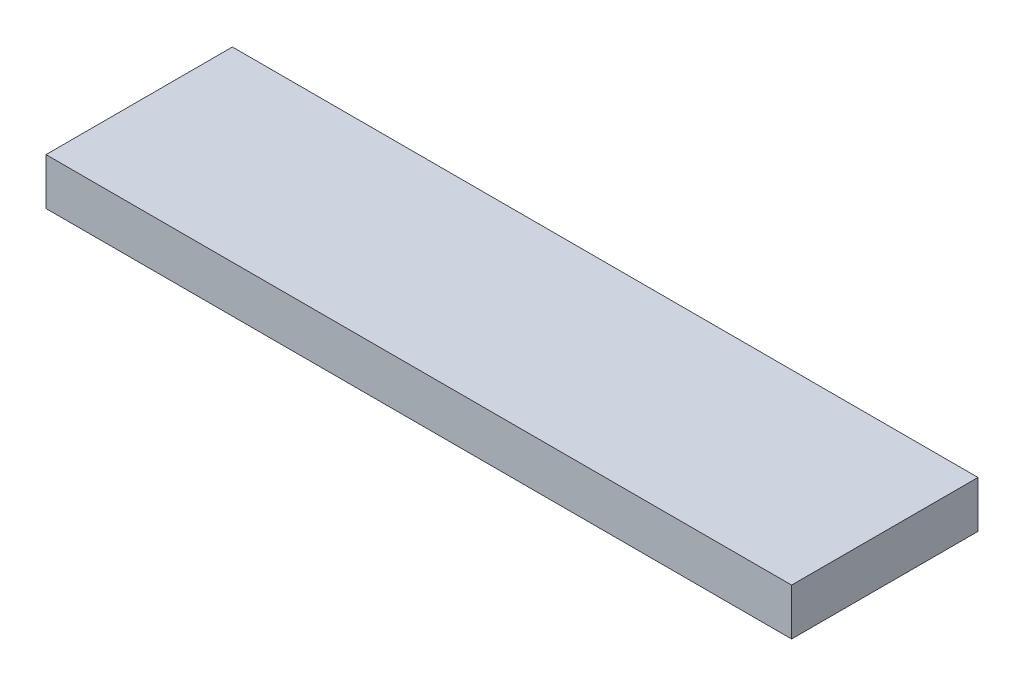
ISO-10303-21;
HEADER;
FILE_DESCRIPTION(('STEP AP214'),'2;1');
FILE_NAME('part.step','',(''),(''),'','','');
FILE_SCHEMA(('AUTOMOTIVE_DESIGN { 1 0 10303 214 1 1 1 1 }'));
ENDSEC;
DATA;
#1=APPLICATION_CONTEXT('core data for automotive mechanical design processes');
#2=APPLICATION_PROTOCOL_DEFINITION('international standard','automotive_design',2000,#1);
#3=PRODUCT_CONTEXT('',#1,'mechanical');
#4=PRODUCT('Part','Part','',(#3));
#5=PRODUCT_RELATED_PRODUCT_CATEGORY('part','',(#4));
#6=PRODUCT_DEFINITION_FORMATION('','',#4);
#7=PRODUCT_DEFINITION_CONTEXT('part definition',#1,'design');
#8=PRODUCT_DEFINITION('design','',#6,#7);
#9=PRODUCT_DEFINITION_SHAPE('','',#8);
#10=(LENGTH_UNIT() NAMED_UNIT(*) SI_UNIT(.MILLI.,.METRE.));
#11=(NAMED_UNIT(*) PLANE_ANGLE_UNIT() SI_UNIT($,.RADIAN.));
#12=(NAMED_UNIT(*) SI_UNIT($,.STERADIAN.) SOLID_ANGLE_UNIT());
#13=UNCERTAINTY_MEASURE_WITH_UNIT(LENGTH_MEASURE(1.E-05),#10,'distance_accuracy_value','');
#14=(GEOMETRIC_REPRESENTATION_CONTEXT(3) GLOBAL_UNCERTAINTY_ASSIGNED_CONTEXT((#13)) GLOBAL_UNIT_ASSIGNED_CONTEXT((#10,
#11,#12)) REPRESENTATION_CONTEXT('',''));
#15=CARTESIAN_POINT('',(0.,0.,0.));
#16=DIRECTION('',(0.,0.,1.));
#17=DIRECTION('',(1.,0.,0.));
#18=AXIS2_PLACEMENT_3D('',#15,#16,#17);
#19=CARTESIAN_POINT('',(-38.1,4.7752,9.525));
#20=DIRECTION('',(-1.,0.,0.));
#21=DIRECTION('',(0.,0.,1.));
#22=AXIS2_PLACEMENT_3D('',#19,#20,#21);
#23=PLANE('',#22);
#24=DIRECTION('',(0.,0.,-1.));
#25=VECTOR('',#24,1.);
#26=CARTESIAN_POINT('',(-38.1,0.,9.525));
#27=LINE('',#26,#25);
#28=CARTESIAN_POINT('',(-38.1,0.,9.525));
#29=VERTEX_POINT('',#28);
#30=CARTESIAN_POINT('',(-38.1,0.,-9.525));
#31=VERTEX_POINT('',#30);
#32=EDGE_CURVE('E118',#29,#31,#27,.T.);
#33=ORIENTED_EDGE('',*,*,#32,.F.);
#34=DIRECTION('',(0.,-1.,0.));
#35=VECTOR('',#34,1.);
#36=CARTESIAN_POINT('',(-38.1,4.7752,9.525));
#37=LINE('',#36,#35);
#38=CARTESIAN_POINT('',(-38.1,4.7752,9.525));
#39=VERTEX_POINT('',#38);
#40=EDGE_CURVE('E11',#39,#29,#37,.T.);
#41=ORIENTED_EDGE('',*,*,#40,.F.);
#42=DIRECTION('',(0.,0.,-1.));
#43=VECTOR('',#42,1.);
#44=CARTESIAN_POINT('',(-38.1,4.7752,9.525));
#45=LINE('',#44,#43);
#46=CARTESIAN_POINT('',(-38.1,4.7752,-9.525));
#47=VERTEX_POINT('',#46);
#48=EDGE_CURVE('E109',#39,#47,#45,.T.);
#49=ORIENTED_EDGE('',*,*,#48,.T.);
#50=DIRECTION('',(0.,-1.,0.));
#51=VECTOR('',#50,1.);
#52=CARTESIAN_POINT('',(-38.1,4.7752,-9.525));
#53=LINE('',#52,#51);
#54=EDGE_CURVE('E48',#47,#31,#53,.T.);
#55=ORIENTED_EDGE('',*,*,#54,.T.);
#56=EDGE_LOOP('',(#33,#41,#49,#55));
#57=FACE_BOUND('',#56,.T.);
#58=ADVANCED_FACE('F45',(#57),#23,.T.);
#59=CARTESIAN_POINT('',(-38.1,4.7752,9.525));
#60=DIRECTION('',(0.,0.,-1.));
#61=DIRECTION('',(-1.,0.,0.));
#62=AXIS2_PLACEMENT_3D('',#59,#60,#61);
#63=PLANE('',#62);
#64=DIRECTION('',(1.,0.,0.));
#65=VECTOR('',#64,1.);
#66=CARTESIAN_POINT('',(-38.1,0.,9.525));
#67=LINE('',#66,#65);
#68=CARTESIAN_POINT('',(38.1,0.,9.525));
#69=VERTEX_POINT('',#68);
#70=EDGE_CURVE('E79',#29,#69,#67,.T.);
#71=ORIENTED_EDGE('',*,*,#70,.T.);
#72=DIRECTION('',(0.,-1.,0.));
#73=VECTOR('',#72,1.);
#74=CARTESIAN_POINT('',(38.1,4.7752,9.525));
#75=LINE('',#74,#73);
#76=CARTESIAN_POINT('',(38.1,4.7752,9.525));
#77=VERTEX_POINT('',#76);
#78=EDGE_CURVE('E55',#77,#69,#75,.T.);
#79=ORIENTED_EDGE('',*,*,#78,.F.);
#80=DIRECTION('',(1.,0.,0.));
#81=VECTOR('',#80,1.);
#82=CARTESIAN_POINT('',(-38.1,4.7752,9.525));
#83=LINE('',#82,#81);
#84=EDGE_CURVE('E96',#39,#77,#83,.T.);
#85=ORIENTED_EDGE('',*,*,#84,.F.);
#86=ORIENTED_EDGE('',*,*,#40,.T.);
#87=EDGE_LOOP('',(#71,#79,#85,#86));
#88=FACE_BOUND('',#87,.T.);
#89=ADVANCED_FACE('F156',(#88),#63,.F.);
#90=CARTESIAN_POINT('',(38.1,4.7752,9.525));
#91=DIRECTION('',(-1.,0.,0.));
#92=DIRECTION('',(0.,0.,1.));
#93=AXIS2_PLACEMENT_3D('',#90,#91,#92);
#94=PLANE('',#93);
#95=DIRECTION('',(0.,0.,-1.));
#96=VECTOR('',#95,1.);
#97=CARTESIAN_POINT('',(38.1,0.,9.525));
#98=LINE('',#97,#96);
#99=CARTESIAN_POINT('',(38.1,0.,-9.525));
#100=VERTEX_POINT('',#99);
#101=EDGE_CURVE('E104',#69,#100,#98,.T.);
#102=ORIENTED_EDGE('',*,*,#101,.T.);
#103=DIRECTION('',(0.,-1.,0.));
#104=VECTOR('',#103,1.);
#105=CARTESIAN_POINT('',(38.1,4.7752,-9.525));
#106=LINE('',#105,#104);
#107=CARTESIAN_POINT('',(38.1,4.7752,-9.525));
#108=VERTEX_POINT('',#107);
#109=EDGE_CURVE('E101',#108,#100,#106,.T.);
#110=ORIENTED_EDGE('',*,*,#109,.F.);
#111=DIRECTION('',(0.,0.,-1.));
#112=VECTOR('',#111,1.);
#113=CARTESIAN_POINT('',(38.1,4.7752,9.525));
#114=LINE('',#113,#112);
#115=EDGE_CURVE('E91',#77,#108,#114,.T.);
#116=ORIENTED_EDGE('',*,*,#115,.F.);
#117=ORIENTED_EDGE('',*,*,#78,.T.);
#118=EDGE_LOOP('',(#102,#110,#116,#117));
#119=FACE_BOUND('',#118,.T.);
#120=ADVANCED_FACE('F102',(#119),#94,.F.);
#121=CARTESIAN_POINT('',(-38.1,4.7752,-9.525));
#122=DIRECTION('',(0.,0.,-1.));
#123=DIRECTION('',(-1.,0.,0.));
#124=AXIS2_PLACEMENT_3D('',#121,#122,#123);
#125=PLANE('',#124);
#126=DIRECTION('',(1.,0.,0.));
#127=VECTOR('',#126,1.);
#128=CARTESIAN_POINT('',(-38.1,0.,-9.525));
#129=LINE('',#128,#127);
#130=EDGE_CURVE('E122',#31,#100,#129,.T.);
#131=ORIENTED_EDGE('',*,*,#130,.F.);
#132=ORIENTED_EDGE('',*,*,#54,.F.);
#133=DIRECTION('',(1.,0.,0.));
#134=VECTOR('',#133,1.);
#135=CARTESIAN_POINT('',(-38.1,4.7752,-9.525));
#136=LINE('',#135,#134);
#137=EDGE_CURVE('E95',#47,#108,#136,.T.);
#138=ORIENTED_EDGE('',*,*,#137,.T.);
#139=ORIENTED_EDGE('',*,*,#109,.T.);
#140=EDGE_LOOP('',(#131,#132,#138,#139));
#141=FACE_BOUND('',#140,.T.);
#142=ADVANCED_FACE('F107',(#141),#125,.T.);
#143=CARTESIAN_POINT('',(0.,4.7752,0.));
#144=DIRECTION('',(0.,-1.,0.));
#145=DIRECTION('',(0.,0.,-1.));
#146=AXIS2_PLACEMENT_3D('',#143,#144,#145);
#147=PLANE('',#146);
#148=ORIENTED_EDGE('',*,*,#48,.F.);
#149=ORIENTED_EDGE('',*,*,#84,.T.);
#150=ORIENTED_EDGE('',*,*,#115,.T.);
#151=ORIENTED_EDGE('',*,*,#137,.F.);
#152=EDGE_LOOP('',(#148,#149,#150,#151));
#153=FACE_BOUND('',#152,.T.);
#154=ADVANCED_FACE('F94',(#153),#147,.F.);
#155=CARTESIAN_POINT('',(0.,0.,0.));
#156=DIRECTION('',(0.,-1.,0.));
#157=DIRECTION('',(0.,0.,-1.));
#158=AXIS2_PLACEMENT_3D('',#155,#156,#157);
#159=PLANE('',#158);
#160=ORIENTED_EDGE('',*,*,#32,.T.);
#161=ORIENTED_EDGE('',*,*,#130,.T.);
#162=ORIENTED_EDGE('',*,*,#101,.F.);
#163=ORIENTED_EDGE('',*,*,#70,.F.);
#164=EDGE_LOOP('',(#160,#161,#162,#163));
#165=FACE_BOUND('',#164,.T.);
#166=ADVANCED_FACE('F133',(#165),#159,.T.);
#167=CLOSED_SHELL('',(#58,#89,#120,#142,#154,#166));
#168=MANIFOLD_SOLID_BREP('B2',#167);
#169=ADVANCED_BREP_SHAPE_REPRESENTATION('',(#18,#168),#14);
#170=SHAPE_DEFINITION_REPRESENTATION(#9,#169);
ENDSEC;
END-ISO-10303-21;
